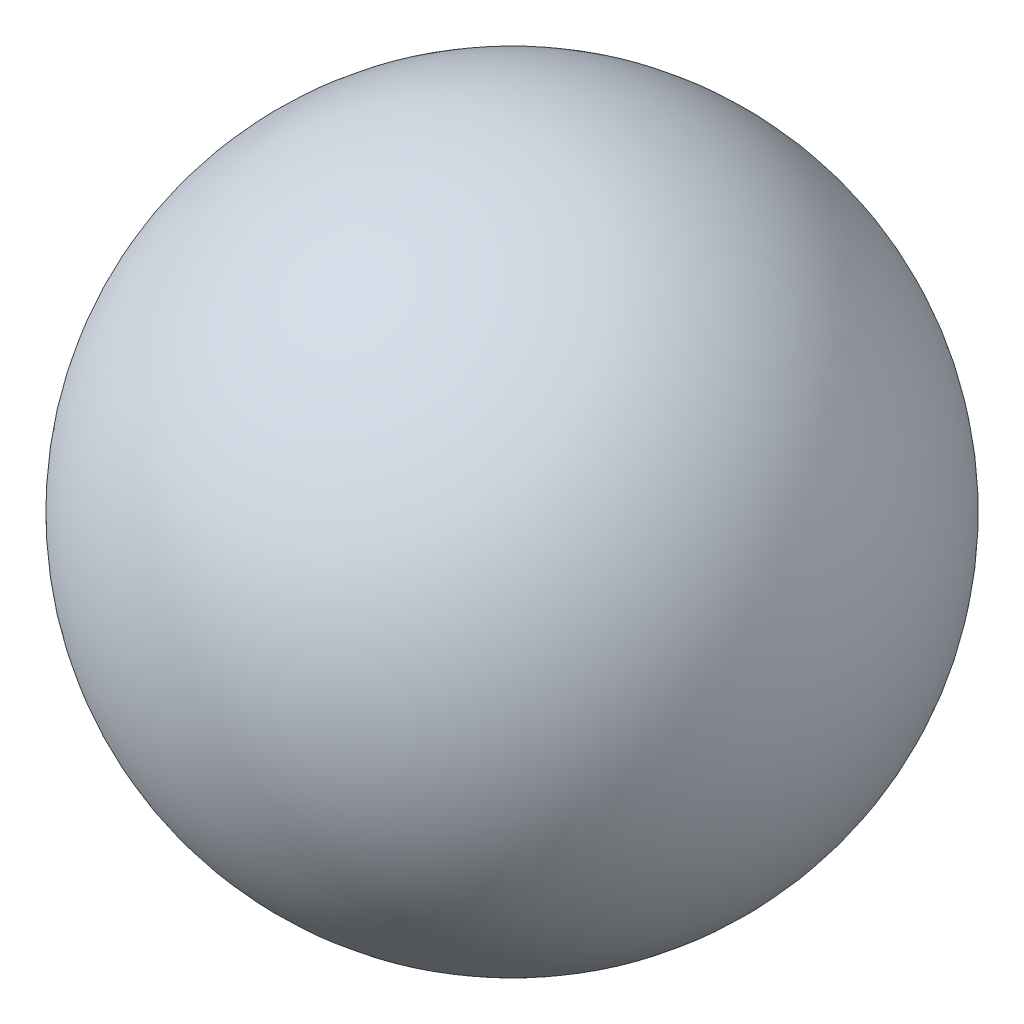
ISO-10303-21;
HEADER;
FILE_DESCRIPTION(('STEP AP214'),'2;1');
FILE_NAME('part.step','',(''),(''),'','','');
FILE_SCHEMA(('AUTOMOTIVE_DESIGN { 1 0 10303 214 1 1 1 1 }'));
ENDSEC;
DATA;
#1=APPLICATION_CONTEXT('core data for automotive mechanical design processes');
#2=APPLICATION_PROTOCOL_DEFINITION('international standard','automotive_design',2000,#1);
#3=PRODUCT_CONTEXT('',#1,'mechanical');
#4=PRODUCT('Part','Part','',(#3));
#5=PRODUCT_RELATED_PRODUCT_CATEGORY('part','',(#4));
#6=PRODUCT_DEFINITION_FORMATION('','',#4);
#7=PRODUCT_DEFINITION_CONTEXT('part definition',#1,'design');
#8=PRODUCT_DEFINITION('design','',#6,#7);
#9=PRODUCT_DEFINITION_SHAPE('','',#8);
#10=(LENGTH_UNIT() NAMED_UNIT(*) SI_UNIT(.MILLI.,.METRE.));
#11=(NAMED_UNIT(*) PLANE_ANGLE_UNIT() SI_UNIT($,.RADIAN.));
#12=(NAMED_UNIT(*) SI_UNIT($,.STERADIAN.) SOLID_ANGLE_UNIT());
#13=UNCERTAINTY_MEASURE_WITH_UNIT(LENGTH_MEASURE(1.E-05),#10,'distance_accuracy_value','');
#14=(GEOMETRIC_REPRESENTATION_CONTEXT(3) GLOBAL_UNCERTAINTY_ASSIGNED_CONTEXT((#13)) GLOBAL_UNIT_ASSIGNED_CONTEXT((#10,
#11,#12)) REPRESENTATION_CONTEXT('',''));
#15=CARTESIAN_POINT('',(0.,0.,0.));
#16=DIRECTION('',(0.,0.,1.));
#17=DIRECTION('',(1.,0.,0.));
#18=AXIS2_PLACEMENT_3D('',#15,#16,#17);
#19=CARTESIAN_POINT('',(0.,0.,0.));
#20=DIRECTION('',(0.,1.,0.));
#21=DIRECTION('',(1.,0.,0.));
#22=AXIS2_PLACEMENT_3D('',#19,#20,#21);
#23=SPHERICAL_SURFACE('',#22,128.);
#24=CARTESIAN_POINT('',(0.,128.,0.));
#25=VERTEX_POINT('',#24);
#26=VERTEX_LOOP('',#25);
#27=FACE_BOUND('',#26,.T.);
#28=ADVANCED_FACE('F33',(#27),#23,.T.);
#29=CLOSED_SHELL('',(#28));
#30=MANIFOLD_SOLID_BREP('B2',#29);
#31=ADVANCED_BREP_SHAPE_REPRESENTATION('',(#18,#30),#14);
#32=SHAPE_DEFINITION_REPRESENTATION(#9,#31);
ENDSEC;
END-ISO-10303-21;
